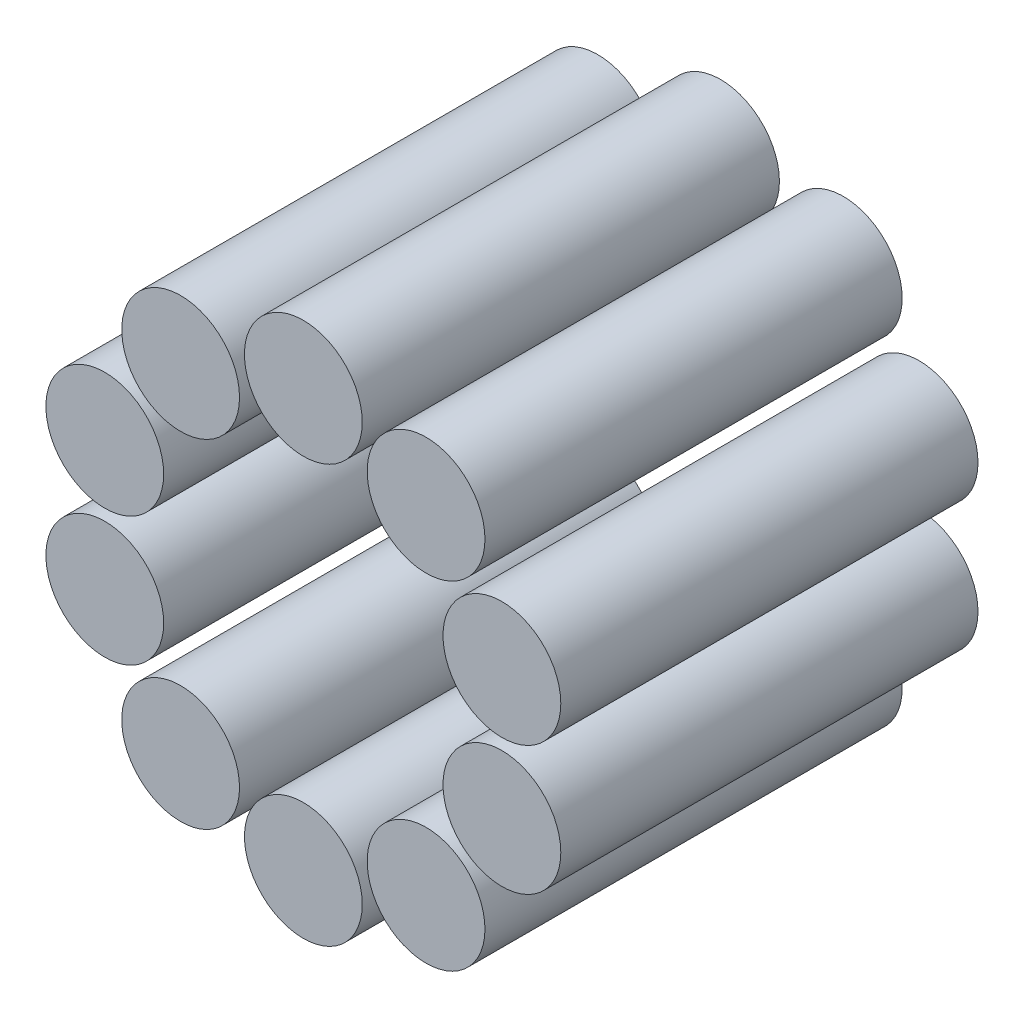
ISO-10303-21;
HEADER;
FILE_DESCRIPTION(('STEP AP214'),'2;1');
FILE_NAME('part.step','',(''),(''),'','','');
FILE_SCHEMA(('AUTOMOTIVE_DESIGN { 1 0 10303 214 1 1 1 1 }'));
ENDSEC;
DATA;
#1=APPLICATION_CONTEXT('core data for automotive mechanical design processes');
#2=APPLICATION_PROTOCOL_DEFINITION('international standard','automotive_design',2000,#1);
#3=PRODUCT_CONTEXT('',#1,'mechanical');
#4=PRODUCT('Part','Part','',(#3));
#5=PRODUCT_RELATED_PRODUCT_CATEGORY('part','',(#4));
#6=PRODUCT_DEFINITION_FORMATION('','',#4);
#7=PRODUCT_DEFINITION_CONTEXT('part definition',#1,'design');
#8=PRODUCT_DEFINITION('design','',#6,#7);
#9=PRODUCT_DEFINITION_SHAPE('','',#8);
#10=(LENGTH_UNIT() NAMED_UNIT(*) SI_UNIT(.MILLI.,.METRE.));
#11=(NAMED_UNIT(*) PLANE_ANGLE_UNIT() SI_UNIT($,.RADIAN.));
#12=(NAMED_UNIT(*) SI_UNIT($,.STERADIAN.) SOLID_ANGLE_UNIT());
#13=UNCERTAINTY_MEASURE_WITH_UNIT(LENGTH_MEASURE(1.E-05),#10,'distance_accuracy_value','');
#14=(GEOMETRIC_REPRESENTATION_CONTEXT(3) GLOBAL_UNCERTAINTY_ASSIGNED_CONTEXT((#13)) GLOBAL_UNIT_ASSIGNED_CONTEXT((#10,
#11,#12)) REPRESENTATION_CONTEXT('',''));
#15=CARTESIAN_POINT('',(0.,0.,0.));
#16=DIRECTION('',(0.,0.,1.));
#17=DIRECTION('',(1.,0.,0.));
#18=AXIS2_PLACEMENT_3D('',#15,#16,#17);
#19=CARTESIAN_POINT('',(19.1206542570742,-26.317322827017,65.));
#20=DIRECTION('',(0.,0.,-1.));
#21=DIRECTION('',(-1.,0.,0.));
#22=AXIS2_PLACEMENT_3D('',#19,#20,#21);
#23=CYLINDRICAL_SURFACE('',#22,9.17500000000001);
#24=CARTESIAN_POINT('',(19.1206542570742,-26.317322827017,65.));
#25=DIRECTION('',(0.,0.,1.));
#26=DIRECTION('',(1.,0.,0.));
#27=AXIS2_PLACEMENT_3D('',#24,#25,#26);
#28=CIRCLE('',#27,9.17500000000001);
#29=CARTESIAN_POINT('',(28.2956542570742,-26.317322827017,65.));
#30=VERTEX_POINT('',#29);
#31=EDGE_CURVE('E11',#30,#30,#28,.T.);
#32=ORIENTED_EDGE('',*,*,#31,.F.);
#33=EDGE_LOOP('',(#32));
#34=FACE_BOUND('',#33,.T.);
#35=CARTESIAN_POINT('',(19.1206542570742,-26.317322827017,0.));
#36=DIRECTION('',(0.,0.,1.));
#37=DIRECTION('',(1.,0.,0.));
#38=AXIS2_PLACEMENT_3D('',#35,#36,#37);
#39=CIRCLE('',#38,9.17500000000001);
#40=CARTESIAN_POINT('',(28.2956542570742,-26.317322827017,0.));
#41=VERTEX_POINT('',#40);
#42=EDGE_CURVE('E46',#41,#41,#39,.T.);
#43=ORIENTED_EDGE('',*,*,#42,.T.);
#44=EDGE_LOOP('',(#43));
#45=FACE_BOUND('',#44,.T.);
#46=ADVANCED_FACE('F43',(#34,#45),#23,.T.);
#47=CARTESIAN_POINT('',(19.1206542570742,-26.317322827017,65.));
#48=DIRECTION('',(0.,0.,1.));
#49=DIRECTION('',(1.,0.,0.));
#50=AXIS2_PLACEMENT_3D('',#47,#48,#49);
#51=PLANE('',#50);
#52=ORIENTED_EDGE('',*,*,#31,.T.);
#53=EDGE_LOOP('',(#52));
#54=FACE_BOUND('',#53,.T.);
#55=ADVANCED_FACE('F58',(#54),#51,.T.);
#56=CARTESIAN_POINT('',(19.1206542570742,-26.317322827017,0.));
#57=DIRECTION('',(0.,0.,1.));
#58=DIRECTION('',(1.,0.,0.));
#59=AXIS2_PLACEMENT_3D('',#56,#57,#58);
#60=PLANE('',#59);
#61=ORIENTED_EDGE('',*,*,#42,.F.);
#62=EDGE_LOOP('',(#61));
#63=FACE_BOUND('',#62,.T.);
#64=ADVANCED_FACE('F56',(#63),#60,.F.);
#65=CLOSED_SHELL('',(#46,#55,#64));
#66=MANIFOLD_SOLID_BREP('B2',#65);
#67=CARTESIAN_POINT('',(30.9378684750813,-10.052322827017,65.));
#68=DIRECTION('',(0.,0.,-1.));
#69=DIRECTION('',(-1.,0.,0.));
#70=AXIS2_PLACEMENT_3D('',#67,#68,#69);
#71=CYLINDRICAL_SURFACE('',#70,9.17499999999996);
#72=CARTESIAN_POINT('',(30.9378684750813,-10.052322827017,65.));
#73=DIRECTION('',(0.,0.,1.));
#74=DIRECTION('',(1.,0.,0.));
#75=AXIS2_PLACEMENT_3D('',#72,#73,#74);
#76=CIRCLE('',#75,9.17499999999996);
#77=CARTESIAN_POINT('',(40.1128684750813,-10.052322827017,65.));
#78=VERTEX_POINT('',#77);
#79=EDGE_CURVE('E42',#78,#78,#76,.T.);
#80=ORIENTED_EDGE('',*,*,#79,.F.);
#81=EDGE_LOOP('',(#80));
#82=FACE_BOUND('',#81,.T.);
#83=CARTESIAN_POINT('',(30.9378684750813,-10.052322827017,0.));
#84=DIRECTION('',(0.,0.,1.));
#85=DIRECTION('',(1.,0.,0.));
#86=AXIS2_PLACEMENT_3D('',#83,#84,#85);
#87=CIRCLE('',#86,9.17499999999996);
#88=CARTESIAN_POINT('',(40.1128684750813,-10.052322827017,0.));
#89=VERTEX_POINT('',#88);
#90=EDGE_CURVE('E98',#89,#89,#87,.T.);
#91=ORIENTED_EDGE('',*,*,#90,.T.);
#92=EDGE_LOOP('',(#91));
#93=FACE_BOUND('',#92,.T.);
#94=ADVANCED_FACE('F95',(#82,#93),#71,.T.);
#95=CARTESIAN_POINT('',(30.9378684750813,-10.052322827017,65.));
#96=DIRECTION('',(0.,0.,1.));
#97=DIRECTION('',(1.,0.,0.));
#98=AXIS2_PLACEMENT_3D('',#95,#96,#97);
#99=PLANE('',#98);
#100=ORIENTED_EDGE('',*,*,#79,.T.);
#101=EDGE_LOOP('',(#100));
#102=FACE_BOUND('',#101,.T.);
#103=ADVANCED_FACE('F110',(#102),#99,.T.);
#104=CARTESIAN_POINT('',(30.9378684750813,-10.052322827017,0.));
#105=DIRECTION('',(0.,0.,1.));
#106=DIRECTION('',(1.,0.,0.));
#107=AXIS2_PLACEMENT_3D('',#104,#105,#106);
#108=PLANE('',#107);
#109=ORIENTED_EDGE('',*,*,#90,.F.);
#110=EDGE_LOOP('',(#109));
#111=FACE_BOUND('',#110,.T.);
#112=ADVANCED_FACE('F108',(#111),#108,.F.);
#113=CLOSED_SHELL('',(#94,#103,#112));
#114=MANIFOLD_SOLID_BREP('B6',#113);
#115=CARTESIAN_POINT('',(30.9378684750813,10.052322827017,65.));
#116=DIRECTION('',(0.,0.,-1.));
#117=DIRECTION('',(-1.,0.,0.));
#118=AXIS2_PLACEMENT_3D('',#115,#116,#117);
#119=CYLINDRICAL_SURFACE('',#118,9.17500000000001);
#120=CARTESIAN_POINT('',(30.9378684750813,10.052322827017,65.));
#121=DIRECTION('',(0.,0.,1.));
#122=DIRECTION('',(1.,0.,0.));
#123=AXIS2_PLACEMENT_3D('',#120,#121,#122);
#124=CIRCLE('',#123,9.17500000000001);
#125=CARTESIAN_POINT('',(40.1128684750814,10.052322827017,65.));
#126=VERTEX_POINT('',#125);
#127=EDGE_CURVE('E94',#126,#126,#124,.T.);
#128=ORIENTED_EDGE('',*,*,#127,.F.);
#129=EDGE_LOOP('',(#128));
#130=FACE_BOUND('',#129,.T.);
#131=CARTESIAN_POINT('',(30.9378684750813,10.052322827017,0.));
#132=DIRECTION('',(0.,0.,1.));
#133=DIRECTION('',(1.,0.,0.));
#134=AXIS2_PLACEMENT_3D('',#131,#132,#133);
#135=CIRCLE('',#134,9.17500000000001);
#136=CARTESIAN_POINT('',(40.1128684750814,10.052322827017,0.));
#137=VERTEX_POINT('',#136);
#138=EDGE_CURVE('E150',#137,#137,#135,.T.);
#139=ORIENTED_EDGE('',*,*,#138,.T.);
#140=EDGE_LOOP('',(#139));
#141=FACE_BOUND('',#140,.T.);
#142=ADVANCED_FACE('F147',(#130,#141),#119,.T.);
#143=CARTESIAN_POINT('',(30.9378684750813,10.052322827017,65.));
#144=DIRECTION('',(0.,0.,1.));
#145=DIRECTION('',(1.,0.,0.));
#146=AXIS2_PLACEMENT_3D('',#143,#144,#145);
#147=PLANE('',#146);
#148=ORIENTED_EDGE('',*,*,#127,.T.);
#149=EDGE_LOOP('',(#148));
#150=FACE_BOUND('',#149,.T.);
#151=ADVANCED_FACE('F162',(#150),#147,.T.);
#152=CARTESIAN_POINT('',(30.9378684750813,10.052322827017,0.));
#153=DIRECTION('',(0.,0.,1.));
#154=DIRECTION('',(1.,0.,0.));
#155=AXIS2_PLACEMENT_3D('',#152,#153,#154);
#156=PLANE('',#155);
#157=ORIENTED_EDGE('',*,*,#138,.F.);
#158=EDGE_LOOP('',(#157));
#159=FACE_BOUND('',#158,.T.);
#160=ADVANCED_FACE('F160',(#159),#156,.F.);
#161=CLOSED_SHELL('',(#142,#151,#160));
#162=MANIFOLD_SOLID_BREP('B37',#161);
#163=CARTESIAN_POINT('',(19.1206542570742,26.317322827017,65.));
#164=DIRECTION('',(0.,0.,-1.));
#165=DIRECTION('',(-1.,0.,0.));
#166=AXIS2_PLACEMENT_3D('',#163,#164,#165);
#167=CYLINDRICAL_SURFACE('',#166,9.17500000000001);
#168=CARTESIAN_POINT('',(19.1206542570742,26.317322827017,65.));
#169=DIRECTION('',(0.,0.,1.));
#170=DIRECTION('',(1.,0.,0.));
#171=AXIS2_PLACEMENT_3D('',#168,#169,#170);
#172=CIRCLE('',#171,9.17500000000001);
#173=CARTESIAN_POINT('',(28.2956542570742,26.317322827017,65.));
#174=VERTEX_POINT('',#173);
#175=EDGE_CURVE('E146',#174,#174,#172,.T.);
#176=ORIENTED_EDGE('',*,*,#175,.F.);
#177=EDGE_LOOP('',(#176));
#178=FACE_BOUND('',#177,.T.);
#179=CARTESIAN_POINT('',(19.1206542570742,26.317322827017,0.));
#180=DIRECTION('',(0.,0.,1.));
#181=DIRECTION('',(1.,0.,0.));
#182=AXIS2_PLACEMENT_3D('',#179,#180,#181);
#183=CIRCLE('',#182,9.17500000000001);
#184=CARTESIAN_POINT('',(28.2956542570742,26.317322827017,0.));
#185=VERTEX_POINT('',#184);
#186=EDGE_CURVE('E202',#185,#185,#183,.T.);
#187=ORIENTED_EDGE('',*,*,#186,.T.);
#188=EDGE_LOOP('',(#187));
#189=FACE_BOUND('',#188,.T.);
#190=ADVANCED_FACE('F199',(#178,#189),#167,.T.);
#191=CARTESIAN_POINT('',(19.1206542570742,26.317322827017,65.));
#192=DIRECTION('',(0.,0.,1.));
#193=DIRECTION('',(1.,0.,0.));
#194=AXIS2_PLACEMENT_3D('',#191,#192,#193);
#195=PLANE('',#194);
#196=ORIENTED_EDGE('',*,*,#175,.T.);
#197=EDGE_LOOP('',(#196));
#198=FACE_BOUND('',#197,.T.);
#199=ADVANCED_FACE('F214',(#198),#195,.T.);
#200=CARTESIAN_POINT('',(19.1206542570742,26.317322827017,0.));
#201=DIRECTION('',(0.,0.,1.));
#202=DIRECTION('',(1.,0.,0.));
#203=AXIS2_PLACEMENT_3D('',#200,#201,#202);
#204=PLANE('',#203);
#205=ORIENTED_EDGE('',*,*,#186,.F.);
#206=EDGE_LOOP('',(#205));
#207=FACE_BOUND('',#206,.T.);
#208=ADVANCED_FACE('F212',(#207),#204,.F.);
#209=CLOSED_SHELL('',(#190,#199,#208));
#210=MANIFOLD_SOLID_BREP('B89',#209);
#211=CARTESIAN_POINT('',(0.,32.53,65.));
#212=DIRECTION('',(0.,0.,-1.));
#213=DIRECTION('',(-1.,0.,0.));
#214=AXIS2_PLACEMENT_3D('',#211,#212,#213);
#215=CYLINDRICAL_SURFACE('',#214,9.17500000000001);
#216=CARTESIAN_POINT('',(0.,32.53,65.));
#217=DIRECTION('',(0.,0.,1.));
#218=DIRECTION('',(1.,0.,0.));
#219=AXIS2_PLACEMENT_3D('',#216,#217,#218);
#220=CIRCLE('',#219,9.17500000000001);
#221=CARTESIAN_POINT('',(9.175,32.53,65.));
#222=VERTEX_POINT('',#221);
#223=EDGE_CURVE('E198',#222,#222,#220,.T.);
#224=ORIENTED_EDGE('',*,*,#223,.F.);
#225=EDGE_LOOP('',(#224));
#226=FACE_BOUND('',#225,.T.);
#227=CARTESIAN_POINT('',(0.,32.53,0.));
#228=DIRECTION('',(0.,0.,1.));
#229=DIRECTION('',(1.,0.,0.));
#230=AXIS2_PLACEMENT_3D('',#227,#228,#229);
#231=CIRCLE('',#230,9.17500000000001);
#232=CARTESIAN_POINT('',(9.175,32.53,0.));
#233=VERTEX_POINT('',#232);
#234=EDGE_CURVE('E254',#233,#233,#231,.T.);
#235=ORIENTED_EDGE('',*,*,#234,.T.);
#236=EDGE_LOOP('',(#235));
#237=FACE_BOUND('',#236,.T.);
#238=ADVANCED_FACE('F251',(#226,#237),#215,.T.);
#239=CARTESIAN_POINT('',(0.,32.53,65.));
#240=DIRECTION('',(0.,0.,1.));
#241=DIRECTION('',(1.,0.,0.));
#242=AXIS2_PLACEMENT_3D('',#239,#240,#241);
#243=PLANE('',#242);
#244=ORIENTED_EDGE('',*,*,#223,.T.);
#245=EDGE_LOOP('',(#244));
#246=FACE_BOUND('',#245,.T.);
#247=ADVANCED_FACE('F266',(#246),#243,.T.);
#248=CARTESIAN_POINT('',(0.,32.53,0.));
#249=DIRECTION('',(0.,0.,1.));
#250=DIRECTION('',(1.,0.,0.));
#251=AXIS2_PLACEMENT_3D('',#248,#249,#250);
#252=PLANE('',#251);
#253=ORIENTED_EDGE('',*,*,#234,.F.);
#254=EDGE_LOOP('',(#253));
#255=FACE_BOUND('',#254,.T.);
#256=ADVANCED_FACE('F264',(#255),#252,.F.);
#257=CLOSED_SHELL('',(#238,#247,#256));
#258=MANIFOLD_SOLID_BREP('B141',#257);
#259=CARTESIAN_POINT('',(-19.1206542570742,26.317322827017,65.));
#260=DIRECTION('',(0.,0.,-1.));
#261=DIRECTION('',(-1.,0.,0.));
#262=AXIS2_PLACEMENT_3D('',#259,#260,#261);
#263=CYLINDRICAL_SURFACE('',#262,9.17500000000001);
#264=CARTESIAN_POINT('',(-19.1206542570742,26.317322827017,65.));
#265=DIRECTION('',(0.,0.,1.));
#266=DIRECTION('',(1.,0.,0.));
#267=AXIS2_PLACEMENT_3D('',#264,#265,#266);
#268=CIRCLE('',#267,9.17500000000001);
#269=CARTESIAN_POINT('',(-9.94565425707415,26.317322827017,65.));
#270=VERTEX_POINT('',#269);
#271=EDGE_CURVE('E250',#270,#270,#268,.T.);
#272=ORIENTED_EDGE('',*,*,#271,.F.);
#273=EDGE_LOOP('',(#272));
#274=FACE_BOUND('',#273,.T.);
#275=CARTESIAN_POINT('',(-19.1206542570742,26.317322827017,0.));
#276=DIRECTION('',(0.,0.,1.));
#277=DIRECTION('',(1.,0.,0.));
#278=AXIS2_PLACEMENT_3D('',#275,#276,#277);
#279=CIRCLE('',#278,9.17500000000001);
#280=CARTESIAN_POINT('',(-9.94565425707415,26.317322827017,0.));
#281=VERTEX_POINT('',#280);
#282=EDGE_CURVE('E306',#281,#281,#279,.T.);
#283=ORIENTED_EDGE('',*,*,#282,.T.);
#284=EDGE_LOOP('',(#283));
#285=FACE_BOUND('',#284,.T.);
#286=ADVANCED_FACE('F303',(#274,#285),#263,.T.);
#287=CARTESIAN_POINT('',(-19.1206542570742,26.317322827017,65.));
#288=DIRECTION('',(0.,0.,1.));
#289=DIRECTION('',(1.,0.,0.));
#290=AXIS2_PLACEMENT_3D('',#287,#288,#289);
#291=PLANE('',#290);
#292=ORIENTED_EDGE('',*,*,#271,.T.);
#293=EDGE_LOOP('',(#292));
#294=FACE_BOUND('',#293,.T.);
#295=ADVANCED_FACE('F318',(#294),#291,.T.);
#296=CARTESIAN_POINT('',(-19.1206542570742,26.317322827017,0.));
#297=DIRECTION('',(0.,0.,1.));
#298=DIRECTION('',(1.,0.,0.));
#299=AXIS2_PLACEMENT_3D('',#296,#297,#298);
#300=PLANE('',#299);
#301=ORIENTED_EDGE('',*,*,#282,.F.);
#302=EDGE_LOOP('',(#301));
#303=FACE_BOUND('',#302,.T.);
#304=ADVANCED_FACE('F316',(#303),#300,.F.);
#305=CLOSED_SHELL('',(#286,#295,#304));
#306=MANIFOLD_SOLID_BREP('B193',#305);
#307=CARTESIAN_POINT('',(-30.9378684750813,10.052322827017,65.));
#308=DIRECTION('',(0.,0.,-1.));
#309=DIRECTION('',(-1.,0.,0.));
#310=AXIS2_PLACEMENT_3D('',#307,#308,#309);
#311=CYLINDRICAL_SURFACE('',#310,9.17500000000001);
#312=CARTESIAN_POINT('',(-30.9378684750813,10.052322827017,65.));
#313=DIRECTION('',(0.,0.,1.));
#314=DIRECTION('',(1.,0.,0.));
#315=AXIS2_PLACEMENT_3D('',#312,#313,#314);
#316=CIRCLE('',#315,9.17500000000001);
#317=CARTESIAN_POINT('',(-21.7628684750813,10.052322827017,65.));
#318=VERTEX_POINT('',#317);
#319=EDGE_CURVE('E302',#318,#318,#316,.T.);
#320=ORIENTED_EDGE('',*,*,#319,.F.);
#321=EDGE_LOOP('',(#320));
#322=FACE_BOUND('',#321,.T.);
#323=CARTESIAN_POINT('',(-30.9378684750813,10.052322827017,0.));
#324=DIRECTION('',(0.,0.,1.));
#325=DIRECTION('',(1.,0.,0.));
#326=AXIS2_PLACEMENT_3D('',#323,#324,#325);
#327=CIRCLE('',#326,9.17500000000001);
#328=CARTESIAN_POINT('',(-21.7628684750813,10.052322827017,0.));
#329=VERTEX_POINT('',#328);
#330=EDGE_CURVE('E358',#329,#329,#327,.T.);
#331=ORIENTED_EDGE('',*,*,#330,.T.);
#332=EDGE_LOOP('',(#331));
#333=FACE_BOUND('',#332,.T.);
#334=ADVANCED_FACE('F355',(#322,#333),#311,.T.);
#335=CARTESIAN_POINT('',(-30.9378684750813,10.052322827017,65.));
#336=DIRECTION('',(0.,0.,1.));
#337=DIRECTION('',(1.,0.,0.));
#338=AXIS2_PLACEMENT_3D('',#335,#336,#337);
#339=PLANE('',#338);
#340=ORIENTED_EDGE('',*,*,#319,.T.);
#341=EDGE_LOOP('',(#340));
#342=FACE_BOUND('',#341,.T.);
#343=ADVANCED_FACE('F370',(#342),#339,.T.);
#344=CARTESIAN_POINT('',(-30.9378684750813,10.052322827017,0.));
#345=DIRECTION('',(0.,0.,1.));
#346=DIRECTION('',(1.,0.,0.));
#347=AXIS2_PLACEMENT_3D('',#344,#345,#346);
#348=PLANE('',#347);
#349=ORIENTED_EDGE('',*,*,#330,.F.);
#350=EDGE_LOOP('',(#349));
#351=FACE_BOUND('',#350,.T.);
#352=ADVANCED_FACE('F368',(#351),#348,.F.);
#353=CLOSED_SHELL('',(#334,#343,#352));
#354=MANIFOLD_SOLID_BREP('B245',#353);
#355=CARTESIAN_POINT('',(-30.9378684750813,-10.052322827017,65.));
#356=DIRECTION('',(0.,0.,-1.));
#357=DIRECTION('',(-1.,0.,0.));
#358=AXIS2_PLACEMENT_3D('',#355,#356,#357);
#359=CYLINDRICAL_SURFACE('',#358,9.17499999999996);
#360=CARTESIAN_POINT('',(-30.9378684750813,-10.052322827017,65.));
#361=DIRECTION('',(0.,0.,1.));
#362=DIRECTION('',(1.,0.,0.));
#363=AXIS2_PLACEMENT_3D('',#360,#361,#362);
#364=CIRCLE('',#363,9.17499999999996);
#365=CARTESIAN_POINT('',(-21.7628684750814,-10.052322827017,65.));
#366=VERTEX_POINT('',#365);
#367=EDGE_CURVE('E354',#366,#366,#364,.T.);
#368=ORIENTED_EDGE('',*,*,#367,.F.);
#369=EDGE_LOOP('',(#368));
#370=FACE_BOUND('',#369,.T.);
#371=CARTESIAN_POINT('',(-30.9378684750813,-10.052322827017,0.));
#372=DIRECTION('',(0.,0.,1.));
#373=DIRECTION('',(1.,0.,0.));
#374=AXIS2_PLACEMENT_3D('',#371,#372,#373);
#375=CIRCLE('',#374,9.17499999999996);
#376=CARTESIAN_POINT('',(-21.7628684750814,-10.052322827017,0.));
#377=VERTEX_POINT('',#376);
#378=EDGE_CURVE('E410',#377,#377,#375,.T.);
#379=ORIENTED_EDGE('',*,*,#378,.T.);
#380=EDGE_LOOP('',(#379));
#381=FACE_BOUND('',#380,.T.);
#382=ADVANCED_FACE('F407',(#370,#381),#359,.T.);
#383=CARTESIAN_POINT('',(-30.9378684750813,-10.052322827017,65.));
#384=DIRECTION('',(0.,0.,1.));
#385=DIRECTION('',(1.,0.,0.));
#386=AXIS2_PLACEMENT_3D('',#383,#384,#385);
#387=PLANE('',#386);
#388=ORIENTED_EDGE('',*,*,#367,.T.);
#389=EDGE_LOOP('',(#388));
#390=FACE_BOUND('',#389,.T.);
#391=ADVANCED_FACE('F422',(#390),#387,.T.);
#392=CARTESIAN_POINT('',(-30.9378684750813,-10.052322827017,0.));
#393=DIRECTION('',(0.,0.,1.));
#394=DIRECTION('',(1.,0.,0.));
#395=AXIS2_PLACEMENT_3D('',#392,#393,#394);
#396=PLANE('',#395);
#397=ORIENTED_EDGE('',*,*,#378,.F.);
#398=EDGE_LOOP('',(#397));
#399=FACE_BOUND('',#398,.T.);
#400=ADVANCED_FACE('F420',(#399),#396,.F.);
#401=CLOSED_SHELL('',(#382,#391,#400));
#402=MANIFOLD_SOLID_BREP('B297',#401);
#403=CARTESIAN_POINT('',(-19.1206542570742,-26.317322827017,65.));
#404=DIRECTION('',(0.,0.,-1.));
#405=DIRECTION('',(-1.,0.,0.));
#406=AXIS2_PLACEMENT_3D('',#403,#404,#405);
#407=CYLINDRICAL_SURFACE('',#406,9.17500000000001);
#408=CARTESIAN_POINT('',(-19.1206542570742,-26.317322827017,65.));
#409=DIRECTION('',(0.,0.,1.));
#410=DIRECTION('',(1.,0.,0.));
#411=AXIS2_PLACEMENT_3D('',#408,#409,#410);
#412=CIRCLE('',#411,9.17500000000001);
#413=CARTESIAN_POINT('',(-9.94565425707415,-26.317322827017,65.));
#414=VERTEX_POINT('',#413);
#415=EDGE_CURVE('E406',#414,#414,#412,.T.);
#416=ORIENTED_EDGE('',*,*,#415,.F.);
#417=EDGE_LOOP('',(#416));
#418=FACE_BOUND('',#417,.T.);
#419=CARTESIAN_POINT('',(-19.1206542570742,-26.317322827017,0.));
#420=DIRECTION('',(0.,0.,1.));
#421=DIRECTION('',(1.,0.,0.));
#422=AXIS2_PLACEMENT_3D('',#419,#420,#421);
#423=CIRCLE('',#422,9.17500000000001);
#424=CARTESIAN_POINT('',(-9.94565425707415,-26.317322827017,0.));
#425=VERTEX_POINT('',#424);
#426=EDGE_CURVE('E461',#425,#425,#423,.T.);
#427=ORIENTED_EDGE('',*,*,#426,.T.);
#428=EDGE_LOOP('',(#427));
#429=FACE_BOUND('',#428,.T.);
#430=ADVANCED_FACE('F458',(#418,#429),#407,.T.);
#431=CARTESIAN_POINT('',(-19.1206542570742,-26.317322827017,65.));
#432=DIRECTION('',(0.,0.,1.));
#433=DIRECTION('',(1.,0.,0.));
#434=AXIS2_PLACEMENT_3D('',#431,#432,#433);
#435=PLANE('',#434);
#436=ORIENTED_EDGE('',*,*,#415,.T.);
#437=EDGE_LOOP('',(#436));
#438=FACE_BOUND('',#437,.T.);
#439=ADVANCED_FACE('F473',(#438),#435,.T.);
#440=CARTESIAN_POINT('',(-19.1206542570742,-26.317322827017,0.));
#441=DIRECTION('',(0.,0.,1.));
#442=DIRECTION('',(1.,0.,0.));
#443=AXIS2_PLACEMENT_3D('',#440,#441,#442);
#444=PLANE('',#443);
#445=ORIENTED_EDGE('',*,*,#426,.F.);
#446=EDGE_LOOP('',(#445));
#447=FACE_BOUND('',#446,.T.);
#448=ADVANCED_FACE('F471',(#447),#444,.F.);
#449=CLOSED_SHELL('',(#430,#439,#448));
#450=MANIFOLD_SOLID_BREP('B349',#449);
#451=CARTESIAN_POINT('',(0.,-32.53,65.));
#452=DIRECTION('',(0.,0.,-1.));
#453=DIRECTION('',(-1.,0.,0.));
#454=AXIS2_PLACEMENT_3D('',#451,#452,#453);
#455=CYLINDRICAL_SURFACE('',#454,9.175);
#456=CARTESIAN_POINT('',(0.,-32.53,65.));
#457=DIRECTION('',(0.,0.,1.));
#458=DIRECTION('',(1.,0.,0.));
#459=AXIS2_PLACEMENT_3D('',#456,#457,#458);
#460=CIRCLE('',#459,9.175);
#461=CARTESIAN_POINT('',(9.175,-32.53,65.));
#462=VERTEX_POINT('',#461);
#463=EDGE_CURVE('E457',#462,#462,#460,.T.);
#464=ORIENTED_EDGE('',*,*,#463,.F.);
#465=EDGE_LOOP('',(#464));
#466=FACE_BOUND('',#465,.T.);
#467=CARTESIAN_POINT('',(0.,-32.53,0.));
#468=DIRECTION('',(0.,0.,1.));
#469=DIRECTION('',(1.,0.,0.));
#470=AXIS2_PLACEMENT_3D('',#467,#468,#469);
#471=CIRCLE('',#470,9.175);
#472=CARTESIAN_POINT('',(9.175,-32.53,0.));
#473=VERTEX_POINT('',#472);
#474=EDGE_CURVE('E505',#473,#473,#471,.T.);
#475=ORIENTED_EDGE('',*,*,#474,.T.);
#476=EDGE_LOOP('',(#475));
#477=FACE_BOUND('',#476,.T.);
#478=ADVANCED_FACE('F502',(#466,#477),#455,.T.);
#479=CARTESIAN_POINT('',(0.,-32.53,65.));
#480=DIRECTION('',(0.,0.,1.));
#481=DIRECTION('',(1.,0.,0.));
#482=AXIS2_PLACEMENT_3D('',#479,#480,#481);
#483=PLANE('',#482);
#484=ORIENTED_EDGE('',*,*,#463,.T.);
#485=EDGE_LOOP('',(#484));
#486=FACE_BOUND('',#485,.T.);
#487=ADVANCED_FACE('F517',(#486),#483,.T.);
#488=CARTESIAN_POINT('',(0.,-32.53,0.));
#489=DIRECTION('',(0.,0.,1.));
#490=DIRECTION('',(1.,0.,0.));
#491=AXIS2_PLACEMENT_3D('',#488,#489,#490);
#492=PLANE('',#491);
#493=ORIENTED_EDGE('',*,*,#474,.F.);
#494=EDGE_LOOP('',(#493));
#495=FACE_BOUND('',#494,.T.);
#496=ADVANCED_FACE('F515',(#495),#492,.F.);
#497=CLOSED_SHELL('',(#478,#487,#496));
#498=MANIFOLD_SOLID_BREP('B401',#497);
#499=ADVANCED_BREP_SHAPE_REPRESENTATION('',(#18,#66,#114,#162,#210,#258,#306,#354,#402,#450,
#498),#14);
#500=SHAPE_DEFINITION_REPRESENTATION(#9,#499);
ENDSEC;
END-ISO-10303-21;
